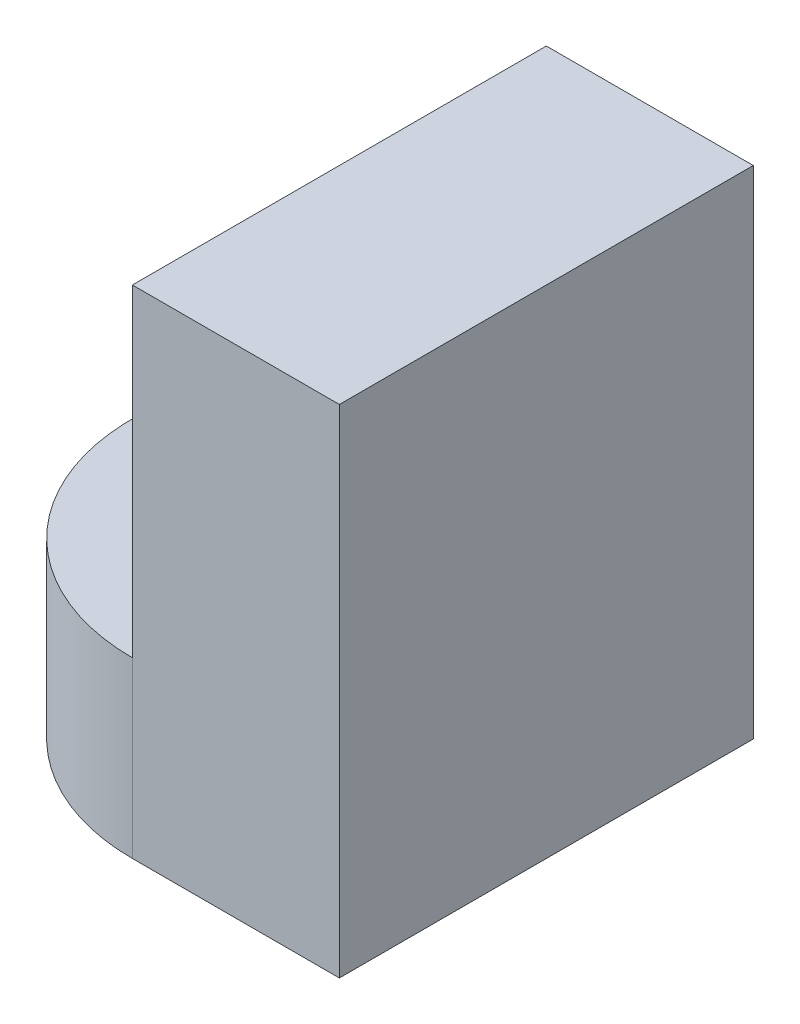
ISO-10303-21;
HEADER;
FILE_DESCRIPTION(('STEP AP214'),'2;1');
FILE_NAME('part.step','',(''),(''),'','','');
FILE_SCHEMA(('AUTOMOTIVE_DESIGN { 1 0 10303 214 1 1 1 1 }'));
ENDSEC;
DATA;
#1=APPLICATION_CONTEXT('core data for automotive mechanical design processes');
#2=APPLICATION_PROTOCOL_DEFINITION('international standard','automotive_design',2000,#1);
#3=PRODUCT_CONTEXT('',#1,'mechanical');
#4=PRODUCT('Part','Part','',(#3));
#5=PRODUCT_RELATED_PRODUCT_CATEGORY('part','',(#4));
#6=PRODUCT_DEFINITION_FORMATION('','',#4);
#7=PRODUCT_DEFINITION_CONTEXT('part definition',#1,'design');
#8=PRODUCT_DEFINITION('design','',#6,#7);
#9=PRODUCT_DEFINITION_SHAPE('','',#8);
#10=(LENGTH_UNIT() NAMED_UNIT(*) SI_UNIT(.MILLI.,.METRE.));
#11=(NAMED_UNIT(*) PLANE_ANGLE_UNIT() SI_UNIT($,.RADIAN.));
#12=(NAMED_UNIT(*) SI_UNIT($,.STERADIAN.) SOLID_ANGLE_UNIT());
#13=UNCERTAINTY_MEASURE_WITH_UNIT(LENGTH_MEASURE(1.E-05),#10,'distance_accuracy_value','');
#14=(GEOMETRIC_REPRESENTATION_CONTEXT(3) GLOBAL_UNCERTAINTY_ASSIGNED_CONTEXT((#13)) GLOBAL_UNIT_ASSIGNED_CONTEXT((#10,
#11,#12)) REPRESENTATION_CONTEXT('',''));
#15=CARTESIAN_POINT('',(0.,0.,0.));
#16=DIRECTION('',(0.,0.,1.));
#17=DIRECTION('',(1.,0.,0.));
#18=AXIS2_PLACEMENT_3D('',#15,#16,#17);
#19=CARTESIAN_POINT('',(0.,2.1,0.));
#20=DIRECTION('',(0.,-1.,0.));
#21=DIRECTION('',(0.,0.,-1.));
#22=AXIS2_PLACEMENT_3D('',#19,#20,#21);
#23=CYLINDRICAL_SURFACE('',#22,2.5);
#24=DIRECTION('',(0.,-1.,0.));
#25=VECTOR('',#24,1.);
#26=CARTESIAN_POINT('',(0.,0.,2.5));
#27=LINE('',#26,#25);
#28=CARTESIAN_POINT('',(0.,2.1,2.5));
#29=VERTEX_POINT('',#28);
#30=CARTESIAN_POINT('',(0.,0.,2.5));
#31=VERTEX_POINT('',#30);
#32=EDGE_CURVE('E121',#29,#31,#27,.T.);
#33=ORIENTED_EDGE('',*,*,#32,.F.);
#34=CARTESIAN_POINT('',(0.,2.1,0.));
#35=DIRECTION('',(0.,1.,0.));
#36=DIRECTION('',(0.,0.,1.));
#37=AXIS2_PLACEMENT_3D('',#34,#35,#36);
#38=CIRCLE('',#37,2.5);
#39=CARTESIAN_POINT('',(0.,2.1,-2.5));
#40=VERTEX_POINT('',#39);
#41=EDGE_CURVE('E11',#40,#29,#38,.T.);
#42=ORIENTED_EDGE('',*,*,#41,.F.);
#43=DIRECTION('',(0.,1.,0.));
#44=VECTOR('',#43,1.);
#45=CARTESIAN_POINT('',(0.,0.,-2.5));
#46=LINE('',#45,#44);
#47=CARTESIAN_POINT('',(0.,0.,-2.5));
#48=VERTEX_POINT('',#47);
#49=EDGE_CURVE('E53',#48,#40,#46,.T.);
#50=ORIENTED_EDGE('',*,*,#49,.F.);
#51=CARTESIAN_POINT('',(0.,0.,0.));
#52=DIRECTION('',(0.,1.,0.));
#53=DIRECTION('',(0.,0.,1.));
#54=AXIS2_PLACEMENT_3D('',#51,#52,#53);
#55=CIRCLE('',#54,2.5);
#56=EDGE_CURVE('E45',#48,#31,#55,.T.);
#57=ORIENTED_EDGE('',*,*,#56,.T.);
#58=EDGE_LOOP('',(#33,#42,#50,#57));
#59=FACE_BOUND('',#58,.T.);
#60=ADVANCED_FACE('F37',(#59),#23,.T.);
#61=CARTESIAN_POINT('',(0.,2.1,0.));
#62=DIRECTION('',(0.,1.,0.));
#63=DIRECTION('',(0.,0.,1.));
#64=AXIS2_PLACEMENT_3D('',#61,#62,#63);
#65=PLANE('',#64);
#66=ORIENTED_EDGE('',*,*,#41,.T.);
#67=DIRECTION('',(0.,0.,-1.));
#68=VECTOR('',#67,1.);
#69=CARTESIAN_POINT('',(0.,2.1,0.));
#70=LINE('',#69,#68);
#71=EDGE_CURVE('E60',#29,#40,#70,.T.);
#72=ORIENTED_EDGE('',*,*,#71,.T.);
#73=EDGE_LOOP('',(#66,#72));
#74=FACE_BOUND('',#73,.T.);
#75=ADVANCED_FACE('F150',(#74),#65,.T.);
#76=CARTESIAN_POINT('',(0.,0.,0.));
#77=DIRECTION('',(0.,1.,0.));
#78=DIRECTION('',(0.,0.,1.));
#79=AXIS2_PLACEMENT_3D('',#76,#77,#78);
#80=PLANE('',#79);
#81=CARTESIAN_POINT('',(0.,0.,0.));
#82=DIRECTION('',(0.,-1.,0.));
#83=DIRECTION('',(0.,0.,-1.));
#84=AXIS2_PLACEMENT_3D('',#81,#82,#83);
#85=CIRCLE('',#84,1.);
#86=CARTESIAN_POINT('',(0.,0.,-1.));
#87=VERTEX_POINT('',#86);
#88=EDGE_CURVE('E124',#87,#87,#85,.T.);
#89=ORIENTED_EDGE('',*,*,#88,.F.);
#90=EDGE_LOOP('',(#89));
#91=FACE_BOUND('',#90,.T.);
#92=ORIENTED_EDGE('',*,*,#56,.F.);
#93=DIRECTION('',(1.,0.,0.));
#94=VECTOR('',#93,1.);
#95=CARTESIAN_POINT('',(0.,0.,-2.5));
#96=LINE('',#95,#94);
#97=CARTESIAN_POINT('',(2.5,0.,-2.5));
#98=VERTEX_POINT('',#97);
#99=EDGE_CURVE('E85',#48,#98,#96,.T.);
#100=ORIENTED_EDGE('',*,*,#99,.T.);
#101=DIRECTION('',(0.,0.,-1.));
#102=VECTOR('',#101,1.);
#103=CARTESIAN_POINT('',(2.5,0.,2.5));
#104=LINE('',#103,#102);
#105=CARTESIAN_POINT('',(2.5,0.,2.5));
#106=VERTEX_POINT('',#105);
#107=EDGE_CURVE('E118',#106,#98,#104,.T.);
#108=ORIENTED_EDGE('',*,*,#107,.F.);
#109=DIRECTION('',(1.,0.,0.));
#110=VECTOR('',#109,1.);
#111=CARTESIAN_POINT('',(0.,0.,2.5));
#112=LINE('',#111,#110);
#113=EDGE_CURVE('E104',#31,#106,#112,.T.);
#114=ORIENTED_EDGE('',*,*,#113,.F.);
#115=EDGE_LOOP('',(#92,#100,#108,#114));
#116=FACE_BOUND('',#115,.T.);
#117=ADVANCED_FACE('F102',(#91,#116),#80,.F.);
#118=CARTESIAN_POINT('',(0.,0.,2.5));
#119=DIRECTION('',(0.,0.,1.));
#120=DIRECTION('',(1.,0.,0.));
#121=AXIS2_PLACEMENT_3D('',#118,#119,#120);
#122=PLANE('',#121);
#123=DIRECTION('',(0.,-1.,0.));
#124=VECTOR('',#123,1.);
#125=CARTESIAN_POINT('',(2.5,0.,2.5));
#126=LINE('',#125,#124);
#127=CARTESIAN_POINT('',(2.5,6.,2.5));
#128=VERTEX_POINT('',#127);
#129=EDGE_CURVE('E111',#128,#106,#126,.T.);
#130=ORIENTED_EDGE('',*,*,#129,.F.);
#131=DIRECTION('',(1.,0.,0.));
#132=VECTOR('',#131,1.);
#133=CARTESIAN_POINT('',(0.,6.,2.5));
#134=LINE('',#133,#132);
#135=CARTESIAN_POINT('',(0.,6.,2.5));
#136=VERTEX_POINT('',#135);
#137=EDGE_CURVE('E108',#136,#128,#134,.T.);
#138=ORIENTED_EDGE('',*,*,#137,.F.);
#139=EDGE_CURVE('E92',#136,#29,#27,.T.);
#140=ORIENTED_EDGE('',*,*,#139,.T.);
#141=ORIENTED_EDGE('',*,*,#32,.T.);
#142=ORIENTED_EDGE('',*,*,#113,.T.);
#143=EDGE_LOOP('',(#130,#138,#140,#141,#142));
#144=FACE_BOUND('',#143,.T.);
#145=ADVANCED_FACE('F159',(#144),#122,.T.);
#146=CARTESIAN_POINT('',(0.,6.,-2.5));
#147=DIRECTION('',(0.,1.,0.));
#148=DIRECTION('',(0.,0.,1.));
#149=AXIS2_PLACEMENT_3D('',#146,#147,#148);
#150=PLANE('',#149);
#151=DIRECTION('',(0.,0.,1.));
#152=VECTOR('',#151,1.);
#153=CARTESIAN_POINT('',(2.5,6.,-2.5));
#154=LINE('',#153,#152);
#155=CARTESIAN_POINT('',(2.5,6.,-2.5));
#156=VERTEX_POINT('',#155);
#157=EDGE_CURVE('E114',#156,#128,#154,.T.);
#158=ORIENTED_EDGE('',*,*,#157,.F.);
#159=DIRECTION('',(1.,0.,0.));
#160=VECTOR('',#159,1.);
#161=CARTESIAN_POINT('',(0.,6.,-2.5));
#162=LINE('',#161,#160);
#163=CARTESIAN_POINT('',(0.,6.,-2.5));
#164=VERTEX_POINT('',#163);
#165=EDGE_CURVE('E91',#164,#156,#162,.T.);
#166=ORIENTED_EDGE('',*,*,#165,.F.);
#167=DIRECTION('',(0.,0.,1.));
#168=VECTOR('',#167,1.);
#169=CARTESIAN_POINT('',(0.,6.,-2.5));
#170=LINE('',#169,#168);
#171=EDGE_CURVE('E98',#164,#136,#170,.T.);
#172=ORIENTED_EDGE('',*,*,#171,.T.);
#173=ORIENTED_EDGE('',*,*,#137,.T.);
#174=EDGE_LOOP('',(#158,#166,#172,#173));
#175=FACE_BOUND('',#174,.T.);
#176=ADVANCED_FACE('F146',(#175),#150,.T.);
#177=CARTESIAN_POINT('',(0.,0.,-2.5));
#178=DIRECTION('',(0.,0.,-1.));
#179=DIRECTION('',(-1.,0.,0.));
#180=AXIS2_PLACEMENT_3D('',#177,#178,#179);
#181=PLANE('',#180);
#182=DIRECTION('',(0.,1.,0.));
#183=VECTOR('',#182,1.);
#184=CARTESIAN_POINT('',(2.5,0.,-2.5));
#185=LINE('',#184,#183);
#186=EDGE_CURVE('E88',#98,#156,#185,.T.);
#187=ORIENTED_EDGE('',*,*,#186,.F.);
#188=ORIENTED_EDGE('',*,*,#99,.F.);
#189=ORIENTED_EDGE('',*,*,#49,.T.);
#190=EDGE_CURVE('E99',#40,#164,#46,.T.);
#191=ORIENTED_EDGE('',*,*,#190,.T.);
#192=ORIENTED_EDGE('',*,*,#165,.T.);
#193=EDGE_LOOP('',(#187,#188,#189,#191,#192));
#194=FACE_BOUND('',#193,.T.);
#195=ADVANCED_FACE('F86',(#194),#181,.T.);
#196=CARTESIAN_POINT('',(0.,0.,0.));
#197=DIRECTION('',(1.,0.,0.));
#198=DIRECTION('',(0.,0.,-1.));
#199=AXIS2_PLACEMENT_3D('',#196,#197,#198);
#200=PLANE('',#199);
#201=CARTESIAN_POINT('',(0.,4.,0.113002847329671));
#202=DIRECTION('',(1.,0.,0.));
#203=DIRECTION('',(0.,0.,-1.));
#204=AXIS2_PLACEMENT_3D('',#201,#202,#203);
#205=CIRCLE('',#204,1.5);
#206=CARTESIAN_POINT('',(0.,4.,-1.38699715267033));
#207=VERTEX_POINT('',#206);
#208=EDGE_CURVE('E40',#207,#207,#205,.F.);
#209=ORIENTED_EDGE('',*,*,#208,.F.);
#210=EDGE_LOOP('',(#209));
#211=FACE_BOUND('',#210,.T.);
#212=ORIENTED_EDGE('',*,*,#71,.F.);
#213=ORIENTED_EDGE('',*,*,#139,.F.);
#214=ORIENTED_EDGE('',*,*,#171,.F.);
#215=ORIENTED_EDGE('',*,*,#190,.F.);
#216=EDGE_LOOP('',(#212,#213,#214,#215));
#217=FACE_BOUND('',#216,.T.);
#218=ADVANCED_FACE('F136',(#211,#217),#200,.F.);
#219=CARTESIAN_POINT('',(2.5,0.,0.));
#220=DIRECTION('',(1.,0.,0.));
#221=DIRECTION('',(0.,0.,-1.));
#222=AXIS2_PLACEMENT_3D('',#219,#220,#221);
#223=PLANE('',#222);
#224=ORIENTED_EDGE('',*,*,#129,.T.);
#225=ORIENTED_EDGE('',*,*,#107,.T.);
#226=ORIENTED_EDGE('',*,*,#186,.T.);
#227=ORIENTED_EDGE('',*,*,#157,.T.);
#228=EDGE_LOOP('',(#224,#225,#226,#227));
#229=FACE_BOUND('',#228,.T.);
#230=ADVANCED_FACE('F138',(#229),#223,.T.);
#231=CARTESIAN_POINT('',(0.,4.,0.113002847329671));
#232=DIRECTION('',(0.,0.,-1.));
#233=DIRECTION('',(0.,1.,0.));
#234=AXIS2_PLACEMENT_3D('',#231,#232,#233);
#235=SPHERICAL_SURFACE('',#234,1.5);
#236=CARTESIAN_POINT('',(0.,4.,0.113002847329671));
#237=DIRECTION('',(1.,0.,0.));
#238=DIRECTION('',(0.,0.,-1.));
#239=AXIS2_PLACEMENT_3D('',#236,#237,#238);
#240=SPHERICAL_SURFACE('',#239,1.5);
#241=ORIENTED_EDGE('',*,*,#208,.T.);
#242=EDGE_LOOP('',(#241));
#243=FACE_BOUND('',#242,.T.);
#244=ADVANCED_FACE('F134',(#243),#240,.F.);
#245=CARTESIAN_POINT('',(0.,2.,0.));
#246=DIRECTION('',(0.,-1.,0.));
#247=DIRECTION('',(0.,0.,-1.));
#248=AXIS2_PLACEMENT_3D('',#245,#246,#247);
#249=CYLINDRICAL_SURFACE('',#248,1.);
#250=CARTESIAN_POINT('',(0.,2.,0.));
#251=DIRECTION('',(0.,-1.,0.));
#252=DIRECTION('',(0.,0.,-1.));
#253=AXIS2_PLACEMENT_3D('',#250,#251,#252);
#254=CIRCLE('',#253,1.);
#255=CARTESIAN_POINT('',(0.,2.,-1.));
#256=VERTEX_POINT('',#255);
#257=EDGE_CURVE('E127',#256,#256,#254,.T.);
#258=ORIENTED_EDGE('',*,*,#257,.F.);
#259=EDGE_LOOP('',(#258));
#260=FACE_BOUND('',#259,.T.);
#261=ORIENTED_EDGE('',*,*,#88,.T.);
#262=EDGE_LOOP('',(#261));
#263=FACE_BOUND('',#262,.T.);
#264=ADVANCED_FACE('F204',(#260,#263),#249,.F.);
#265=CARTESIAN_POINT('',(0.,2.,0.));
#266=DIRECTION('',(0.,-1.,0.));
#267=DIRECTION('',(0.,0.,-1.));
#268=AXIS2_PLACEMENT_3D('',#265,#266,#267);
#269=PLANE('',#268);
#270=ORIENTED_EDGE('',*,*,#257,.T.);
#271=EDGE_LOOP('',(#270));
#272=FACE_BOUND('',#271,.T.);
#273=ADVANCED_FACE('F220',(#272),#269,.T.);
#274=CLOSED_SHELL('',(#60,#75,#117,#145,#176,#195,#218,#230,#244,#264,#273));
#275=MANIFOLD_SOLID_BREP('B2',#274);
#276=ADVANCED_BREP_SHAPE_REPRESENTATION('',(#18,#275),#14);
#277=SHAPE_DEFINITION_REPRESENTATION(#9,#276);
ENDSEC;
END-ISO-10303-21;
